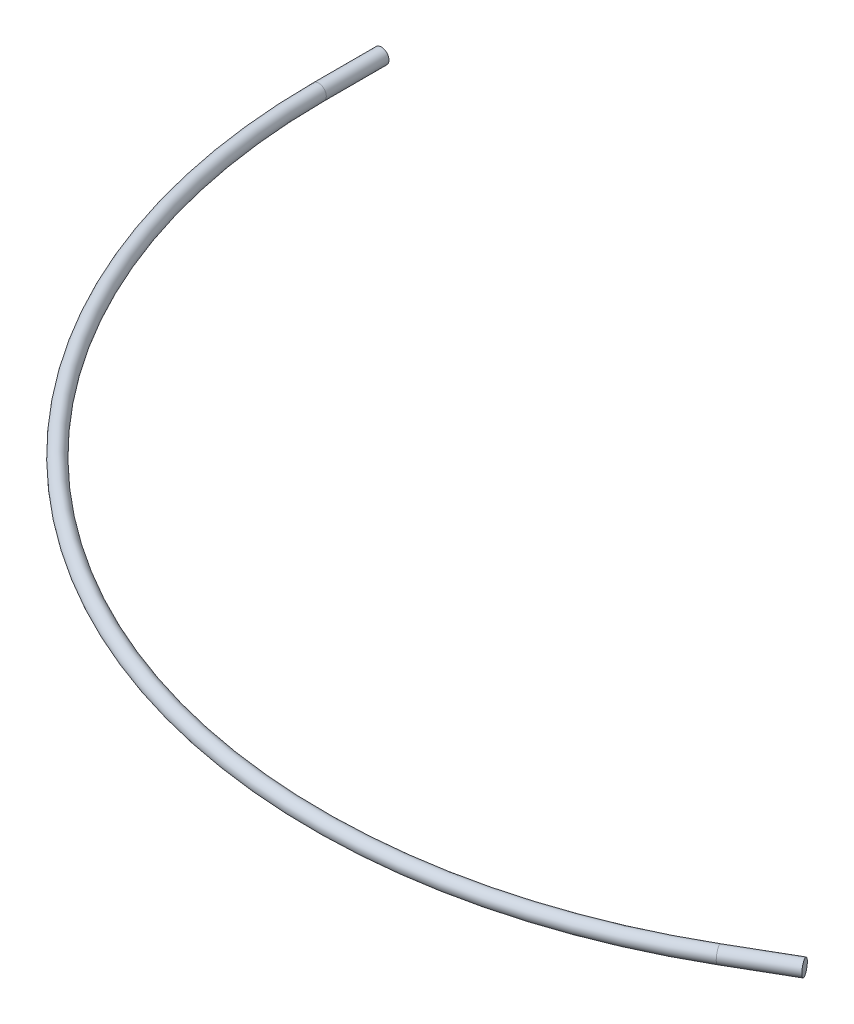
ISO-10303-21;
HEADER;
FILE_DESCRIPTION(('STEP AP214'),'2;1');
FILE_NAME('part.step','',(''),(''),'','','');
FILE_SCHEMA(('AUTOMOTIVE_DESIGN { 1 0 10303 214 1 1 1 1 }'));
ENDSEC;
DATA;
#1=APPLICATION_CONTEXT('core data for automotive mechanical design processes');
#2=APPLICATION_PROTOCOL_DEFINITION('international standard','automotive_design',2000,#1);
#3=PRODUCT_CONTEXT('',#1,'mechanical');
#4=PRODUCT('Part','Part','',(#3));
#5=PRODUCT_RELATED_PRODUCT_CATEGORY('part','',(#4));
#6=PRODUCT_DEFINITION_FORMATION('','',#4);
#7=PRODUCT_DEFINITION_CONTEXT('part definition',#1,'design');
#8=PRODUCT_DEFINITION('design','',#6,#7);
#9=PRODUCT_DEFINITION_SHAPE('','',#8);
#10=(LENGTH_UNIT() NAMED_UNIT(*) SI_UNIT(.MILLI.,.METRE.));
#11=(NAMED_UNIT(*) PLANE_ANGLE_UNIT() SI_UNIT($,.RADIAN.));
#12=(NAMED_UNIT(*) SI_UNIT($,.STERADIAN.) SOLID_ANGLE_UNIT());
#13=UNCERTAINTY_MEASURE_WITH_UNIT(LENGTH_MEASURE(1.E-05),#10,'distance_accuracy_value','');
#14=(GEOMETRIC_REPRESENTATION_CONTEXT(3) GLOBAL_UNCERTAINTY_ASSIGNED_CONTEXT((#13)) GLOBAL_UNIT_ASSIGNED_CONTEXT((#10,
#11,#12)) REPRESENTATION_CONTEXT('',''));
#15=CARTESIAN_POINT('',(0.,0.,0.));
#16=DIRECTION('',(0.,0.,1.));
#17=DIRECTION('',(1.,0.,0.));
#18=AXIS2_PLACEMENT_3D('',#15,#16,#17);
#19=CARTESIAN_POINT('',(0.,0.,0.));
#20=DIRECTION('',(0.,-1.,0.));
#21=DIRECTION('',(0.,0.,-1.));
#22=AXIS2_PLACEMENT_3D('',#19,#20,#21);
#23=TOROIDAL_SURFACE('',#22,201.5,2.4);
#24=CARTESIAN_POINT('',(100.750000000001,0.,174.504118862564));
#25=DIRECTION('',(0.866025403784436,0.,-0.500000000000004));
#26=DIRECTION('',(-0.500000000000004,0.,-0.866025403784436));
#27=AXIS2_PLACEMENT_3D('',#24,#25,#26);
#28=CIRCLE('',#27,2.4);
#29=CARTESIAN_POINT('',(101.950000000001,0.,176.582579831647));
#30=VERTEX_POINT('',#29);
#31=EDGE_CURVE('E10',#30,#30,#28,.T.);
#32=CARTESIAN_POINT('',(-201.5,0.,0.));
#33=DIRECTION('',(0.,0.,1.));
#34=DIRECTION('',(1.,0.,0.));
#35=AXIS2_PLACEMENT_3D('',#32,#33,#34);
#36=CIRCLE('',#35,2.4);
#37=CARTESIAN_POINT('',(-203.9,0.,0.));
#38=VERTEX_POINT('',#37);
#39=EDGE_CURVE('E36',#38,#38,#36,.T.);
#40=CARTESIAN_POINT('',(0.,0.,0.));
#41=DIRECTION('',(0.,-1.,0.));
#42=DIRECTION('',(0.,0.,-1.));
#43=AXIS2_PLACEMENT_3D('',#40,#41,#42);
#44=CIRCLE('',#43,203.9);
#45=EDGE_CURVE('',#30,#38,#44,.T.);
#46=ORIENTED_EDGE('',*,*,#31,.F.);
#47=ORIENTED_EDGE('',*,*,#39,.T.);
#48=ORIENTED_EDGE('',*,*,#45,.T.);
#49=ORIENTED_EDGE('',*,*,#45,.F.);
#50=EDGE_LOOP('',(#46,#48,#47,#49));
#51=FACE_BOUND('',#50,.T.);
#52=ADVANCED_FACE('F30',(#51),#23,.T.);
#53=CARTESIAN_POINT('',(118.07050807569,0.,164.504118862564));
#54=DIRECTION('',(-0.866025403784436,0.,0.500000000000004));
#55=DIRECTION('',(0.500000000000004,0.,0.866025403784436));
#56=AXIS2_PLACEMENT_3D('',#53,#54,#55);
#57=CYLINDRICAL_SURFACE('',#56,2.4);
#58=CARTESIAN_POINT('',(118.07050807569,0.,164.504118862564));
#59=DIRECTION('',(0.866025403784436,0.,-0.500000000000004));
#60=DIRECTION('',(-0.500000000000004,0.,-0.866025403784436));
#61=AXIS2_PLACEMENT_3D('',#58,#59,#60);
#62=CIRCLE('',#61,2.4);
#63=CARTESIAN_POINT('',(116.87050807569,0.,162.425657893481));
#64=VERTEX_POINT('',#63);
#65=EDGE_CURVE('E40',#64,#64,#62,.T.);
#66=ORIENTED_EDGE('',*,*,#65,.F.);
#67=EDGE_LOOP('',(#66));
#68=FACE_BOUND('',#67,.T.);
#69=ORIENTED_EDGE('',*,*,#31,.T.);
#70=EDGE_LOOP('',(#69));
#71=FACE_BOUND('',#70,.T.);
#72=ADVANCED_FACE('F62',(#68,#71),#57,.T.);
#73=CARTESIAN_POINT('',(118.07050807569,0.,164.504118862564));
#74=DIRECTION('',(0.866025403784436,0.,-0.500000000000004));
#75=DIRECTION('',(-0.500000000000004,0.,-0.866025403784436));
#76=AXIS2_PLACEMENT_3D('',#73,#74,#75);
#77=PLANE('',#76);
#78=ORIENTED_EDGE('',*,*,#65,.T.);
#79=EDGE_LOOP('',(#78));
#80=FACE_BOUND('',#79,.T.);
#81=ADVANCED_FACE('F55',(#80),#77,.T.);
#82=CARTESIAN_POINT('',(-201.5,0.,-20.));
#83=DIRECTION('',(0.,0.,1.));
#84=DIRECTION('',(1.,0.,0.));
#85=AXIS2_PLACEMENT_3D('',#82,#83,#84);
#86=CYLINDRICAL_SURFACE('',#85,2.4);
#87=CARTESIAN_POINT('',(-201.5,0.,-20.));
#88=DIRECTION('',(0.,0.,-1.));
#89=DIRECTION('',(-1.,0.,0.));
#90=AXIS2_PLACEMENT_3D('',#87,#88,#89);
#91=CIRCLE('',#90,2.4);
#92=CARTESIAN_POINT('',(-203.9,0.,-20.));
#93=VERTEX_POINT('',#92);
#94=EDGE_CURVE('E44',#93,#93,#91,.T.);
#95=ORIENTED_EDGE('',*,*,#94,.F.);
#96=EDGE_LOOP('',(#95));
#97=FACE_BOUND('',#96,.T.);
#98=ORIENTED_EDGE('',*,*,#39,.F.);
#99=EDGE_LOOP('',(#98));
#100=FACE_BOUND('',#99,.T.);
#101=ADVANCED_FACE('F52',(#97,#100),#86,.T.);
#102=CARTESIAN_POINT('',(-201.5,0.,-20.));
#103=DIRECTION('',(0.,0.,-1.));
#104=DIRECTION('',(-1.,0.,0.));
#105=AXIS2_PLACEMENT_3D('',#102,#103,#104);
#106=PLANE('',#105);
#107=ORIENTED_EDGE('',*,*,#94,.T.);
#108=EDGE_LOOP('',(#107));
#109=FACE_BOUND('',#108,.T.);
#110=ADVANCED_FACE('F50',(#109),#106,.T.);
#111=CLOSED_SHELL('',(#52,#72,#81,#101,#110));
#112=MANIFOLD_SOLID_BREP('B2',#111);
#113=ADVANCED_BREP_SHAPE_REPRESENTATION('',(#18,#112),#14);
#114=SHAPE_DEFINITION_REPRESENTATION(#9,#113);
ENDSEC;
END-ISO-10303-21;
